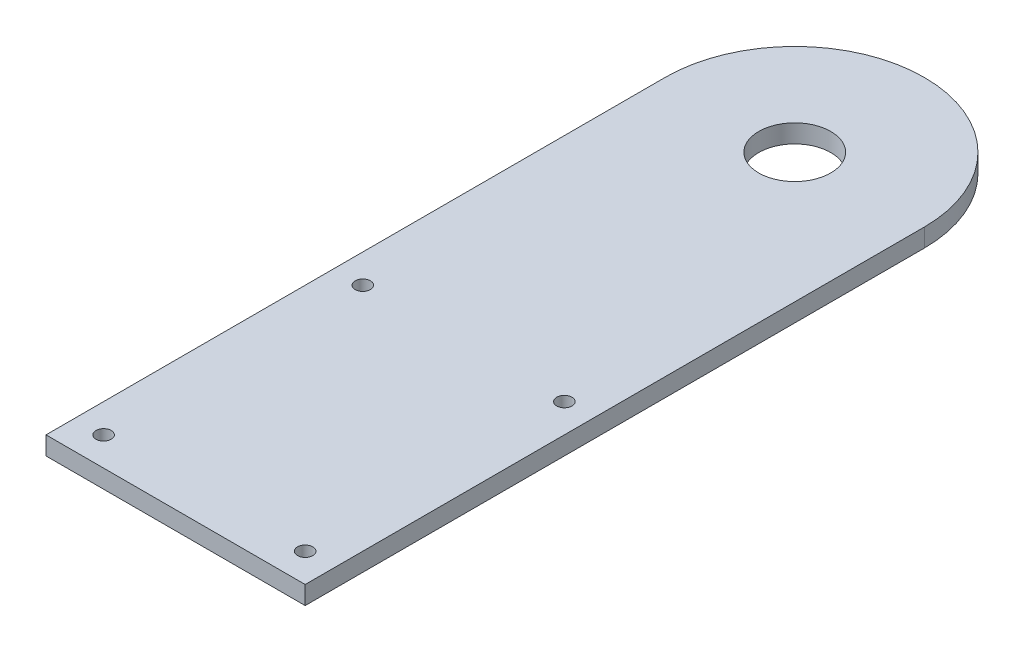
ISO-10303-21;
HEADER;
FILE_DESCRIPTION(('STEP AP214'),'2;1');
FILE_NAME('part.step','',(''),(''),'','','');
FILE_SCHEMA(('AUTOMOTIVE_DESIGN { 1 0 10303 214 1 1 1 1 }'));
ENDSEC;
DATA;
#1=APPLICATION_CONTEXT('core data for automotive mechanical design processes');
#2=APPLICATION_PROTOCOL_DEFINITION('international standard','automotive_design',2000,#1);
#3=PRODUCT_CONTEXT('',#1,'mechanical');
#4=PRODUCT('Part','Part','',(#3));
#5=PRODUCT_RELATED_PRODUCT_CATEGORY('part','',(#4));
#6=PRODUCT_DEFINITION_FORMATION('','',#4);
#7=PRODUCT_DEFINITION_CONTEXT('part definition',#1,'design');
#8=PRODUCT_DEFINITION('design','',#6,#7);
#9=PRODUCT_DEFINITION_SHAPE('','',#8);
#10=(LENGTH_UNIT() NAMED_UNIT(*) SI_UNIT(.MILLI.,.METRE.));
#11=(NAMED_UNIT(*) PLANE_ANGLE_UNIT() SI_UNIT($,.RADIAN.));
#12=(NAMED_UNIT(*) SI_UNIT($,.STERADIAN.) SOLID_ANGLE_UNIT());
#13=UNCERTAINTY_MEASURE_WITH_UNIT(LENGTH_MEASURE(1.E-05),#10,'distance_accuracy_value','');
#14=(GEOMETRIC_REPRESENTATION_CONTEXT(3) GLOBAL_UNCERTAINTY_ASSIGNED_CONTEXT((#13)) GLOBAL_UNIT_ASSIGNED_CONTEXT((#10,
#11,#12)) REPRESENTATION_CONTEXT('',''));
#15=CARTESIAN_POINT('',(0.,0.,0.));
#16=DIRECTION('',(0.,0.,1.));
#17=DIRECTION('',(1.,0.,0.));
#18=AXIS2_PLACEMENT_3D('',#15,#16,#17);
#19=CARTESIAN_POINT('',(-45.,-6.35,107.5));
#20=DIRECTION('',(0.,0.,1.));
#21=DIRECTION('',(1.,0.,0.));
#22=AXIS2_PLACEMENT_3D('',#19,#20,#21);
#23=PLANE('',#22);
#24=DIRECTION('',(1.,0.,0.));
#25=VECTOR('',#24,1.);
#26=CARTESIAN_POINT('',(-45.,0.,107.5));
#27=LINE('',#26,#25);
#28=CARTESIAN_POINT('',(-45.,0.,107.5));
#29=VERTEX_POINT('',#28);
#30=CARTESIAN_POINT('',(45.,0.,107.5));
#31=VERTEX_POINT('',#30);
#32=EDGE_CURVE('E98',#29,#31,#27,.T.);
#33=ORIENTED_EDGE('',*,*,#32,.F.);
#34=DIRECTION('',(0.,1.,0.));
#35=VECTOR('',#34,1.);
#36=CARTESIAN_POINT('',(-45.,-6.35,107.5));
#37=LINE('',#36,#35);
#38=CARTESIAN_POINT('',(-45.,-6.35,107.5));
#39=VERTEX_POINT('',#38);
#40=EDGE_CURVE('E11',#39,#29,#37,.T.);
#41=ORIENTED_EDGE('',*,*,#40,.F.);
#42=DIRECTION('',(1.,0.,0.));
#43=VECTOR('',#42,1.);
#44=CARTESIAN_POINT('',(-45.,-6.35,107.5));
#45=LINE('',#44,#43);
#46=CARTESIAN_POINT('',(45.,-6.35,107.5));
#47=VERTEX_POINT('',#46);
#48=EDGE_CURVE('E91',#39,#47,#45,.T.);
#49=ORIENTED_EDGE('',*,*,#48,.T.);
#50=DIRECTION('',(0.,1.,0.));
#51=VECTOR('',#50,1.);
#52=CARTESIAN_POINT('',(45.,-6.35,107.5));
#53=LINE('',#52,#51);
#54=EDGE_CURVE('E36',#47,#31,#53,.T.);
#55=ORIENTED_EDGE('',*,*,#54,.T.);
#56=EDGE_LOOP('',(#33,#41,#49,#55));
#57=FACE_BOUND('',#56,.T.);
#58=ADVANCED_FACE('F33',(#57),#23,.T.);
#59=CARTESIAN_POINT('',(-45.,-6.35,107.5));
#60=DIRECTION('',(-1.,0.,0.));
#61=DIRECTION('',(0.,0.,1.));
#62=AXIS2_PLACEMENT_3D('',#59,#60,#61);
#63=PLANE('',#62);
#64=DIRECTION('',(0.,0.,1.));
#65=VECTOR('',#64,1.);
#66=CARTESIAN_POINT('',(-45.,0.,107.5));
#67=LINE('',#66,#65);
#68=CARTESIAN_POINT('',(-45.,0.,-107.5));
#69=VERTEX_POINT('',#68);
#70=EDGE_CURVE('E93',#69,#29,#67,.T.);
#71=ORIENTED_EDGE('',*,*,#70,.F.);
#72=DIRECTION('',(0.,1.,0.));
#73=VECTOR('',#72,1.);
#74=CARTESIAN_POINT('',(-45.,-6.35,-107.5));
#75=LINE('',#74,#73);
#76=CARTESIAN_POINT('',(-45.,-6.35,-107.5));
#77=VERTEX_POINT('',#76);
#78=EDGE_CURVE('E42',#77,#69,#75,.T.);
#79=ORIENTED_EDGE('',*,*,#78,.F.);
#80=DIRECTION('',(0.,0.,1.));
#81=VECTOR('',#80,1.);
#82=CARTESIAN_POINT('',(-45.,-6.35,107.5));
#83=LINE('',#82,#81);
#84=EDGE_CURVE('E88',#77,#39,#83,.T.);
#85=ORIENTED_EDGE('',*,*,#84,.T.);
#86=ORIENTED_EDGE('',*,*,#40,.T.);
#87=EDGE_LOOP('',(#71,#79,#85,#86));
#88=FACE_BOUND('',#87,.T.);
#89=ADVANCED_FACE('F109',(#88),#63,.T.);
#90=CARTESIAN_POINT('',(0.,-6.35,-107.5));
#91=DIRECTION('',(0.,1.,0.));
#92=DIRECTION('',(0.,0.,1.));
#93=AXIS2_PLACEMENT_3D('',#90,#91,#92);
#94=CYLINDRICAL_SURFACE('',#93,45.);
#95=CARTESIAN_POINT('',(0.,0.,-107.5));
#96=DIRECTION('',(0.,1.,0.));
#97=DIRECTION('',(0.,0.,-1.));
#98=AXIS2_PLACEMENT_3D('',#95,#96,#97);
#99=CIRCLE('',#98,45.);
#100=CARTESIAN_POINT('',(45.,0.,-107.5));
#101=VERTEX_POINT('',#100);
#102=EDGE_CURVE('E83',#101,#69,#99,.T.);
#103=ORIENTED_EDGE('',*,*,#102,.F.);
#104=DIRECTION('',(0.,1.,0.));
#105=VECTOR('',#104,1.);
#106=CARTESIAN_POINT('',(45.,-6.35,-107.5));
#107=LINE('',#106,#105);
#108=CARTESIAN_POINT('',(45.,-6.35,-107.5));
#109=VERTEX_POINT('',#108);
#110=EDGE_CURVE('E78',#109,#101,#107,.T.);
#111=ORIENTED_EDGE('',*,*,#110,.F.);
#112=CARTESIAN_POINT('',(0.,-6.35,-107.5));
#113=DIRECTION('',(0.,1.,0.));
#114=DIRECTION('',(0.,0.,-1.));
#115=AXIS2_PLACEMENT_3D('',#112,#113,#114);
#116=CIRCLE('',#115,45.);
#117=EDGE_CURVE('E81',#109,#77,#116,.T.);
#118=ORIENTED_EDGE('',*,*,#117,.T.);
#119=ORIENTED_EDGE('',*,*,#78,.T.);
#120=EDGE_LOOP('',(#103,#111,#118,#119));
#121=FACE_BOUND('',#120,.T.);
#122=ADVANCED_FACE('F80',(#121),#94,.T.);
#123=CARTESIAN_POINT('',(45.,-6.35,107.5));
#124=DIRECTION('',(1.,0.,0.));
#125=DIRECTION('',(0.,0.,-1.));
#126=AXIS2_PLACEMENT_3D('',#123,#124,#125);
#127=PLANE('',#126);
#128=DIRECTION('',(0.,0.,-1.));
#129=VECTOR('',#128,1.);
#130=CARTESIAN_POINT('',(45.,0.,107.5));
#131=LINE('',#130,#129);
#132=EDGE_CURVE('E101',#31,#101,#131,.T.);
#133=ORIENTED_EDGE('',*,*,#132,.F.);
#134=ORIENTED_EDGE('',*,*,#54,.F.);
#135=DIRECTION('',(0.,0.,-1.));
#136=VECTOR('',#135,1.);
#137=CARTESIAN_POINT('',(45.,-6.35,107.5));
#138=LINE('',#137,#136);
#139=EDGE_CURVE('E87',#47,#109,#138,.T.);
#140=ORIENTED_EDGE('',*,*,#139,.T.);
#141=ORIENTED_EDGE('',*,*,#110,.T.);
#142=EDGE_LOOP('',(#133,#134,#140,#141));
#143=FACE_BOUND('',#142,.T.);
#144=ADVANCED_FACE('F90',(#143),#127,.T.);
#145=CARTESIAN_POINT('',(0.,-6.35,-107.5));
#146=DIRECTION('',(0.,-1.,0.));
#147=DIRECTION('',(0.,0.,-1.));
#148=AXIS2_PLACEMENT_3D('',#145,#146,#147);
#149=PLANE('',#148);
#150=CARTESIAN_POINT('',(-35.,-6.35,7.49999999999998));
#151=DIRECTION('',(0.,1.,0.));
#152=DIRECTION('',(0.,0.,1.));
#153=AXIS2_PLACEMENT_3D('',#150,#151,#152);
#154=CIRCLE('',#153,2.65);
#155=CARTESIAN_POINT('',(-35.,-6.35,10.15));
#156=VERTEX_POINT('',#155);
#157=EDGE_CURVE('E154',#156,#156,#154,.T.);
#158=ORIENTED_EDGE('',*,*,#157,.T.);
#159=EDGE_LOOP('',(#158));
#160=FACE_BOUND('',#159,.T.);
#161=CARTESIAN_POINT('',(35.,-6.35,7.5));
#162=DIRECTION('',(0.,1.,0.));
#163=DIRECTION('',(0.,0.,1.));
#164=AXIS2_PLACEMENT_3D('',#161,#162,#163);
#165=CIRCLE('',#164,2.65);
#166=CARTESIAN_POINT('',(35.,-6.35,10.15));
#167=VERTEX_POINT('',#166);
#168=EDGE_CURVE('E164',#167,#167,#165,.T.);
#169=ORIENTED_EDGE('',*,*,#168,.T.);
#170=EDGE_LOOP('',(#169));
#171=FACE_BOUND('',#170,.T.);
#172=CARTESIAN_POINT('',(-35.,-6.35,97.5));
#173=DIRECTION('',(0.,1.,0.));
#174=DIRECTION('',(0.,0.,1.));
#175=AXIS2_PLACEMENT_3D('',#172,#173,#174);
#176=CIRCLE('',#175,2.65);
#177=CARTESIAN_POINT('',(-35.,-6.35,100.15));
#178=VERTEX_POINT('',#177);
#179=EDGE_CURVE('E170',#178,#178,#176,.T.);
#180=ORIENTED_EDGE('',*,*,#179,.T.);
#181=EDGE_LOOP('',(#180));
#182=FACE_BOUND('',#181,.T.);
#183=CARTESIAN_POINT('',(35.,-6.35,97.5));
#184=DIRECTION('',(0.,1.,0.));
#185=DIRECTION('',(0.,0.,1.));
#186=AXIS2_PLACEMENT_3D('',#183,#184,#185);
#187=CIRCLE('',#186,2.65);
#188=CARTESIAN_POINT('',(35.,-6.35,100.15));
#189=VERTEX_POINT('',#188);
#190=EDGE_CURVE('E176',#189,#189,#187,.T.);
#191=ORIENTED_EDGE('',*,*,#190,.T.);
#192=EDGE_LOOP('',(#191));
#193=FACE_BOUND('',#192,.T.);
#194=CARTESIAN_POINT('',(0.,-6.35,-107.5));
#195=DIRECTION('',(0.,1.,0.));
#196=DIRECTION('',(0.,0.,1.));
#197=AXIS2_PLACEMENT_3D('',#194,#195,#196);
#198=CIRCLE('',#197,12.5);
#199=CARTESIAN_POINT('',(0.,-6.35,-95.));
#200=VERTEX_POINT('',#199);
#201=EDGE_CURVE('E102',#200,#200,#198,.T.);
#202=ORIENTED_EDGE('',*,*,#201,.T.);
#203=EDGE_LOOP('',(#202));
#204=FACE_BOUND('',#203,.T.);
#205=ORIENTED_EDGE('',*,*,#48,.F.);
#206=ORIENTED_EDGE('',*,*,#84,.F.);
#207=ORIENTED_EDGE('',*,*,#117,.F.);
#208=ORIENTED_EDGE('',*,*,#139,.F.);
#209=EDGE_LOOP('',(#205,#206,#207,#208));
#210=FACE_BOUND('',#209,.T.);
#211=ADVANCED_FACE('F86',(#160,#171,#182,#193,#204,#210),#149,.T.);
#212=CARTESIAN_POINT('',(0.,0.,-107.5));
#213=DIRECTION('',(0.,-1.,0.));
#214=DIRECTION('',(0.,0.,-1.));
#215=AXIS2_PLACEMENT_3D('',#212,#213,#214);
#216=PLANE('',#215);
#217=CARTESIAN_POINT('',(-35.,0.,7.49999999999998));
#218=DIRECTION('',(0.,1.,0.));
#219=DIRECTION('',(0.,0.,1.));
#220=AXIS2_PLACEMENT_3D('',#217,#218,#219);
#221=CIRCLE('',#220,2.65);
#222=CARTESIAN_POINT('',(-35.,0.,10.15));
#223=VERTEX_POINT('',#222);
#224=EDGE_CURVE('E157',#223,#223,#221,.T.);
#225=ORIENTED_EDGE('',*,*,#224,.F.);
#226=EDGE_LOOP('',(#225));
#227=FACE_BOUND('',#226,.T.);
#228=CARTESIAN_POINT('',(35.,0.,7.5));
#229=DIRECTION('',(0.,1.,0.));
#230=DIRECTION('',(0.,0.,1.));
#231=AXIS2_PLACEMENT_3D('',#228,#229,#230);
#232=CIRCLE('',#231,2.65);
#233=CARTESIAN_POINT('',(35.,0.,10.15));
#234=VERTEX_POINT('',#233);
#235=EDGE_CURVE('E159',#234,#234,#232,.T.);
#236=ORIENTED_EDGE('',*,*,#235,.F.);
#237=EDGE_LOOP('',(#236));
#238=FACE_BOUND('',#237,.T.);
#239=CARTESIAN_POINT('',(-35.,0.,97.5));
#240=DIRECTION('',(0.,1.,0.));
#241=DIRECTION('',(0.,0.,1.));
#242=AXIS2_PLACEMENT_3D('',#239,#240,#241);
#243=CIRCLE('',#242,2.65);
#244=CARTESIAN_POINT('',(-35.,0.,100.15));
#245=VERTEX_POINT('',#244);
#246=EDGE_CURVE('E167',#245,#245,#243,.T.);
#247=ORIENTED_EDGE('',*,*,#246,.F.);
#248=EDGE_LOOP('',(#247));
#249=FACE_BOUND('',#248,.T.);
#250=CARTESIAN_POINT('',(35.,0.,97.5));
#251=DIRECTION('',(0.,1.,0.));
#252=DIRECTION('',(0.,0.,1.));
#253=AXIS2_PLACEMENT_3D('',#250,#251,#252);
#254=CIRCLE('',#253,2.65);
#255=CARTESIAN_POINT('',(35.,0.,100.15));
#256=VERTEX_POINT('',#255);
#257=EDGE_CURVE('E173',#256,#256,#254,.T.);
#258=ORIENTED_EDGE('',*,*,#257,.F.);
#259=EDGE_LOOP('',(#258));
#260=FACE_BOUND('',#259,.T.);
#261=CARTESIAN_POINT('',(0.,0.,-107.5));
#262=DIRECTION('',(0.,1.,0.));
#263=DIRECTION('',(0.,0.,1.));
#264=AXIS2_PLACEMENT_3D('',#261,#262,#263);
#265=CIRCLE('',#264,12.5);
#266=CARTESIAN_POINT('',(0.,0.,-95.));
#267=VERTEX_POINT('',#266);
#268=EDGE_CURVE('E179',#267,#267,#265,.T.);
#269=ORIENTED_EDGE('',*,*,#268,.F.);
#270=EDGE_LOOP('',(#269));
#271=FACE_BOUND('',#270,.T.);
#272=ORIENTED_EDGE('',*,*,#32,.T.);
#273=ORIENTED_EDGE('',*,*,#132,.T.);
#274=ORIENTED_EDGE('',*,*,#102,.T.);
#275=ORIENTED_EDGE('',*,*,#70,.T.);
#276=EDGE_LOOP('',(#272,#273,#274,#275));
#277=FACE_BOUND('',#276,.T.);
#278=ADVANCED_FACE('F108',(#227,#238,#249,#260,#271,#277),#216,.F.);
#279=CARTESIAN_POINT('',(0.,-6.35,-107.5));
#280=DIRECTION('',(0.,1.,0.));
#281=DIRECTION('',(0.,0.,1.));
#282=AXIS2_PLACEMENT_3D('',#279,#280,#281);
#283=CYLINDRICAL_SURFACE('',#282,12.5);
#284=ORIENTED_EDGE('',*,*,#201,.F.);
#285=EDGE_LOOP('',(#284));
#286=FACE_BOUND('',#285,.T.);
#287=ORIENTED_EDGE('',*,*,#268,.T.);
#288=EDGE_LOOP('',(#287));
#289=FACE_BOUND('',#288,.T.);
#290=ADVANCED_FACE('F127',(#286,#289),#283,.F.);
#291=CARTESIAN_POINT('',(35.,0.,97.5));
#292=DIRECTION('',(0.,1.,0.));
#293=DIRECTION('',(0.,0.,1.));
#294=AXIS2_PLACEMENT_3D('',#291,#292,#293);
#295=CYLINDRICAL_SURFACE('',#294,2.65);
#296=ORIENTED_EDGE('',*,*,#190,.F.);
#297=EDGE_LOOP('',(#296));
#298=FACE_BOUND('',#297,.T.);
#299=ORIENTED_EDGE('',*,*,#257,.T.);
#300=EDGE_LOOP('',(#299));
#301=FACE_BOUND('',#300,.T.);
#302=ADVANCED_FACE('F134',(#298,#301),#295,.F.);
#303=CARTESIAN_POINT('',(-35.,0.,97.5));
#304=DIRECTION('',(0.,1.,0.));
#305=DIRECTION('',(0.,0.,1.));
#306=AXIS2_PLACEMENT_3D('',#303,#304,#305);
#307=CYLINDRICAL_SURFACE('',#306,2.65);
#308=ORIENTED_EDGE('',*,*,#179,.F.);
#309=EDGE_LOOP('',(#308));
#310=FACE_BOUND('',#309,.T.);
#311=ORIENTED_EDGE('',*,*,#246,.T.);
#312=EDGE_LOOP('',(#311));
#313=FACE_BOUND('',#312,.T.);
#314=ADVANCED_FACE('F138',(#310,#313),#307,.F.);
#315=CARTESIAN_POINT('',(35.,0.,7.5));
#316=DIRECTION('',(0.,1.,0.));
#317=DIRECTION('',(0.,0.,1.));
#318=AXIS2_PLACEMENT_3D('',#315,#316,#317);
#319=CYLINDRICAL_SURFACE('',#318,2.65);
#320=ORIENTED_EDGE('',*,*,#168,.F.);
#321=EDGE_LOOP('',(#320));
#322=FACE_BOUND('',#321,.T.);
#323=ORIENTED_EDGE('',*,*,#235,.T.);
#324=EDGE_LOOP('',(#323));
#325=FACE_BOUND('',#324,.T.);
#326=ADVANCED_FACE('F142',(#322,#325),#319,.F.);
#327=CARTESIAN_POINT('',(-35.,0.,7.49999999999998));
#328=DIRECTION('',(0.,1.,0.));
#329=DIRECTION('',(0.,0.,1.));
#330=AXIS2_PLACEMENT_3D('',#327,#328,#329);
#331=CYLINDRICAL_SURFACE('',#330,2.65);
#332=ORIENTED_EDGE('',*,*,#157,.F.);
#333=EDGE_LOOP('',(#332));
#334=FACE_BOUND('',#333,.T.);
#335=ORIENTED_EDGE('',*,*,#224,.T.);
#336=EDGE_LOOP('',(#335));
#337=FACE_BOUND('',#336,.T.);
#338=ADVANCED_FACE('F146',(#334,#337),#331,.F.);
#339=CLOSED_SHELL('',(#58,#89,#122,#144,#211,#278,#290,#302,#314,#326,#338));
#340=MANIFOLD_SOLID_BREP('B2',#339);
#341=ADVANCED_BREP_SHAPE_REPRESENTATION('',(#18,#340),#14);
#342=SHAPE_DEFINITION_REPRESENTATION(#9,#341);
ENDSEC;
END-ISO-10303-21;
